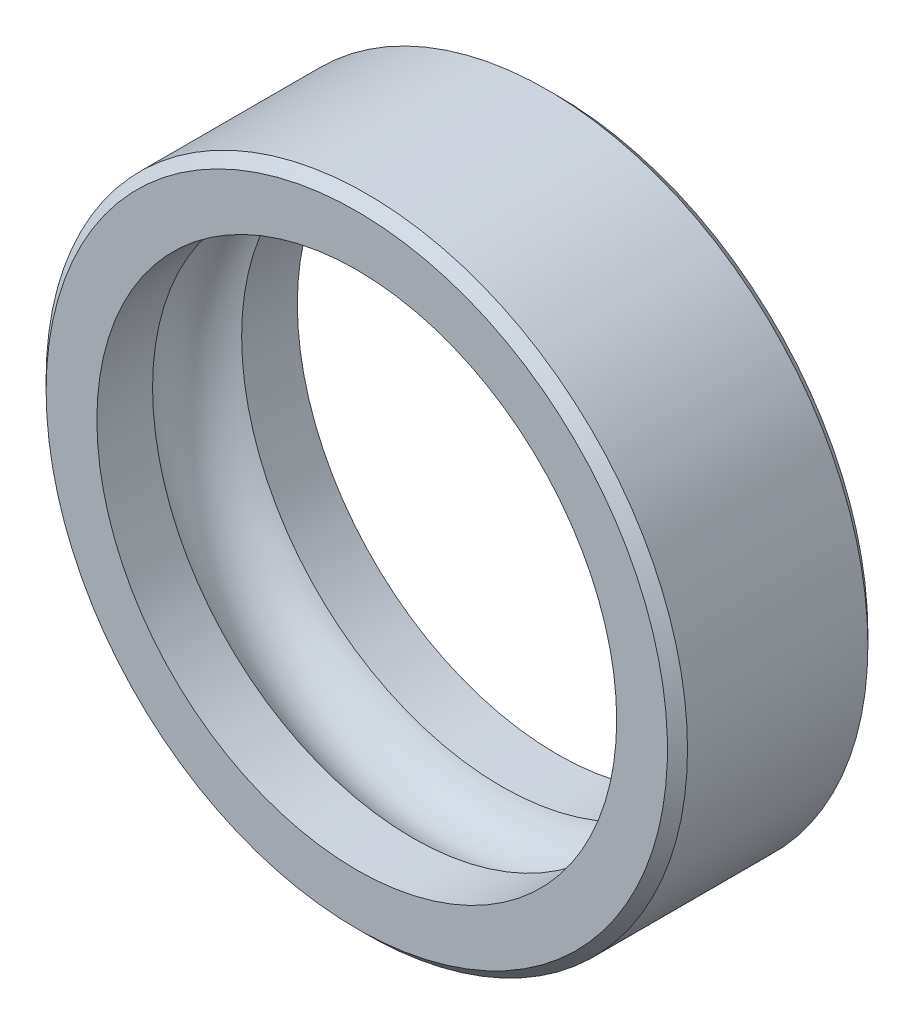
ISO-10303-21;
HEADER;
FILE_DESCRIPTION(('STEP AP214'),'2;1');
FILE_NAME('part.step','',(''),(''),'','','');
FILE_SCHEMA(('AUTOMOTIVE_DESIGN { 1 0 10303 214 1 1 1 1 }'));
ENDSEC;
DATA;
#1=APPLICATION_CONTEXT('core data for automotive mechanical design processes');
#2=APPLICATION_PROTOCOL_DEFINITION('international standard','automotive_design',2000,#1);
#3=PRODUCT_CONTEXT('',#1,'mechanical');
#4=PRODUCT('Part','Part','',(#3));
#5=PRODUCT_RELATED_PRODUCT_CATEGORY('part','',(#4));
#6=PRODUCT_DEFINITION_FORMATION('','',#4);
#7=PRODUCT_DEFINITION_CONTEXT('part definition',#1,'design');
#8=PRODUCT_DEFINITION('design','',#6,#7);
#9=PRODUCT_DEFINITION_SHAPE('','',#8);
#10=(LENGTH_UNIT() NAMED_UNIT(*) SI_UNIT(.MILLI.,.METRE.));
#11=(NAMED_UNIT(*) PLANE_ANGLE_UNIT() SI_UNIT($,.RADIAN.));
#12=(NAMED_UNIT(*) SI_UNIT($,.STERADIAN.) SOLID_ANGLE_UNIT());
#13=UNCERTAINTY_MEASURE_WITH_UNIT(LENGTH_MEASURE(1.E-05),#10,'distance_accuracy_value','');
#14=(GEOMETRIC_REPRESENTATION_CONTEXT(3) GLOBAL_UNCERTAINTY_ASSIGNED_CONTEXT((#13)) GLOBAL_UNIT_ASSIGNED_CONTEXT((#10,
#11,#12)) REPRESENTATION_CONTEXT('',''));
#15=CARTESIAN_POINT('',(0.,0.,0.));
#16=DIRECTION('',(0.,0.,1.));
#17=DIRECTION('',(1.,0.,0.));
#18=AXIS2_PLACEMENT_3D('',#15,#16,#17);
#19=CARTESIAN_POINT('',(0.,0.,0.));
#20=DIRECTION('',(0.,0.,1.));
#21=DIRECTION('',(1.,0.,0.));
#22=AXIS2_PLACEMENT_3D('',#19,#20,#21);
#23=TOROIDAL_SURFACE('',#22,6.,1.21175743903915);
#24=CARTESIAN_POINT('',(0.,0.,-1.11111111111111));
#25=DIRECTION('',(0.,0.,1.));
#26=DIRECTION('',(1.,0.,0.));
#27=AXIS2_PLACEMENT_3D('',#24,#25,#26);
#28=CIRCLE('',#27,6.48351648351648);
#29=CARTESIAN_POINT('',(6.48351648351648,0.,-1.11111111111111));
#30=VERTEX_POINT('',#29);
#31=EDGE_CURVE('E33',#30,#30,#28,.F.);
#32=ORIENTED_EDGE('',*,*,#31,.T.);
#33=EDGE_LOOP('',(#32));
#34=FACE_BOUND('',#33,.T.);
#35=CARTESIAN_POINT('',(0.,0.,1.11111111111111));
#36=DIRECTION('',(0.,0.,1.));
#37=DIRECTION('',(1.,0.,0.));
#38=AXIS2_PLACEMENT_3D('',#35,#36,#37);
#39=CIRCLE('',#38,6.48351648351648);
#40=CARTESIAN_POINT('',(6.48351648351648,0.,1.11111111111111));
#41=VERTEX_POINT('',#40);
#42=EDGE_CURVE('E30',#41,#41,#39,.T.);
#43=ORIENTED_EDGE('',*,*,#42,.T.);
#44=EDGE_LOOP('',(#43));
#45=FACE_BOUND('',#44,.T.);
#46=ADVANCED_FACE('F15',(#34,#45),#23,.F.);
#47=CARTESIAN_POINT('',(0.,0.,2.5));
#48=DIRECTION('',(0.,0.,1.));
#49=DIRECTION('',(1.,0.,0.));
#50=AXIS2_PLACEMENT_3D('',#47,#48,#49);
#51=CYLINDRICAL_SURFACE('',#50,6.48351648351648);
#52=ORIENTED_EDGE('',*,*,#31,.F.);
#53=EDGE_LOOP('',(#52));
#54=FACE_BOUND('',#53,.T.);
#55=CARTESIAN_POINT('',(0.,0.,-2.5));
#56=DIRECTION('',(0.,0.,1.));
#57=DIRECTION('',(1.,0.,0.));
#58=AXIS2_PLACEMENT_3D('',#55,#56,#57);
#59=CIRCLE('',#58,6.48351648351648);
#60=CARTESIAN_POINT('',(6.48351648351648,0.,-2.5));
#61=VERTEX_POINT('',#60);
#62=EDGE_CURVE('E18',#61,#61,#59,.F.);
#63=ORIENTED_EDGE('',*,*,#62,.T.);
#64=EDGE_LOOP('',(#63));
#65=FACE_BOUND('',#64,.T.);
#66=ADVANCED_FACE('F47',(#54,#65),#51,.F.);
#67=CARTESIAN_POINT('',(0.,0.,2.5));
#68=DIRECTION('',(0.,0.,1.));
#69=DIRECTION('',(1.,0.,0.));
#70=AXIS2_PLACEMENT_3D('',#67,#68,#69);
#71=CYLINDRICAL_SURFACE('',#70,6.48351648351648);
#72=ORIENTED_EDGE('',*,*,#42,.F.);
#73=EDGE_LOOP('',(#72));
#74=FACE_BOUND('',#73,.T.);
#75=CARTESIAN_POINT('',(0.,0.,2.5));
#76=DIRECTION('',(0.,0.,1.));
#77=DIRECTION('',(1.,0.,0.));
#78=AXIS2_PLACEMENT_3D('',#75,#76,#77);
#79=CIRCLE('',#78,6.48351648351648);
#80=CARTESIAN_POINT('',(6.48351648351648,0.,2.5));
#81=VERTEX_POINT('',#80);
#82=EDGE_CURVE('E40',#81,#81,#79,.T.);
#83=ORIENTED_EDGE('',*,*,#82,.T.);
#84=EDGE_LOOP('',(#83));
#85=FACE_BOUND('',#84,.T.);
#86=ADVANCED_FACE('F52',(#74,#85),#71,.F.);
#87=CARTESIAN_POINT('',(0.,7.75,-2.5));
#88=DIRECTION('',(0.,0.,1.));
#89=DIRECTION('',(1.,0.,0.));
#90=AXIS2_PLACEMENT_3D('',#87,#88,#89);
#91=PLANE('',#90);
#92=CARTESIAN_POINT('',(0.,0.,-2.5));
#93=DIRECTION('',(0.,0.,1.));
#94=DIRECTION('',(1.,0.,0.));
#95=AXIS2_PLACEMENT_3D('',#92,#93,#94);
#96=CIRCLE('',#95,7.75);
#97=CARTESIAN_POINT('',(7.75,0.,-2.5));
#98=VERTEX_POINT('',#97);
#99=EDGE_CURVE('E38',#98,#98,#96,.T.);
#100=ORIENTED_EDGE('',*,*,#99,.F.);
#101=EDGE_LOOP('',(#100));
#102=FACE_BOUND('',#101,.T.);
#103=ORIENTED_EDGE('',*,*,#62,.F.);
#104=EDGE_LOOP('',(#103));
#105=FACE_BOUND('',#104,.T.);
#106=ADVANCED_FACE('F49',(#102,#105),#91,.F.);
#107=CARTESIAN_POINT('',(0.,7.75,2.5));
#108=DIRECTION('',(0.,0.,-1.));
#109=DIRECTION('',(-1.,0.,0.));
#110=AXIS2_PLACEMENT_3D('',#107,#108,#109);
#111=PLANE('',#110);
#112=ORIENTED_EDGE('',*,*,#82,.F.);
#113=EDGE_LOOP('',(#112));
#114=FACE_BOUND('',#113,.T.);
#115=CARTESIAN_POINT('',(0.,0.,2.5));
#116=DIRECTION('',(0.,0.,-1.));
#117=DIRECTION('',(-1.,0.,0.));
#118=AXIS2_PLACEMENT_3D('',#115,#116,#117);
#119=CIRCLE('',#118,7.75);
#120=CARTESIAN_POINT('',(-7.75,0.,2.5));
#121=VERTEX_POINT('',#120);
#122=EDGE_CURVE('E27',#121,#121,#119,.T.);
#123=ORIENTED_EDGE('',*,*,#122,.F.);
#124=EDGE_LOOP('',(#123));
#125=FACE_BOUND('',#124,.T.);
#126=ADVANCED_FACE('F51',(#114,#125),#111,.F.);
#127=CARTESIAN_POINT('',(0.,0.,-2.25));
#128=DIRECTION('',(0.,0.,1.));
#129=DIRECTION('',(1.,0.,0.));
#130=AXIS2_PLACEMENT_3D('',#127,#128,#129);
#131=CONICAL_SURFACE('',#130,8.,0.785398163397451);
#132=CARTESIAN_POINT('',(0.,0.,-2.25));
#133=DIRECTION('',(0.,0.,1.));
#134=DIRECTION('',(1.,0.,0.));
#135=AXIS2_PLACEMENT_3D('',#132,#133,#134);
#136=CIRCLE('',#135,8.);
#137=CARTESIAN_POINT('',(8.,0.,-2.25));
#138=VERTEX_POINT('',#137);
#139=EDGE_CURVE('E22',#138,#138,#136,.T.);
#140=ORIENTED_EDGE('',*,*,#139,.F.);
#141=EDGE_LOOP('',(#140));
#142=FACE_BOUND('',#141,.T.);
#143=ORIENTED_EDGE('',*,*,#99,.T.);
#144=EDGE_LOOP('',(#143));
#145=FACE_BOUND('',#144,.T.);
#146=ADVANCED_FACE('F60',(#142,#145),#131,.T.);
#147=CARTESIAN_POINT('',(0.,0.,2.25));
#148=DIRECTION('',(0.,0.,-1.));
#149=DIRECTION('',(-1.,0.,0.));
#150=AXIS2_PLACEMENT_3D('',#147,#148,#149);
#151=CONICAL_SURFACE('',#150,8.,0.785398163397451);
#152=CARTESIAN_POINT('',(0.,0.,2.25));
#153=DIRECTION('',(0.,0.,1.));
#154=DIRECTION('',(1.,0.,0.));
#155=AXIS2_PLACEMENT_3D('',#152,#153,#154);
#156=CIRCLE('',#155,8.);
#157=CARTESIAN_POINT('',(8.,0.,2.25));
#158=VERTEX_POINT('',#157);
#159=EDGE_CURVE('E10',#158,#158,#156,.F.);
#160=ORIENTED_EDGE('',*,*,#159,.F.);
#161=EDGE_LOOP('',(#160));
#162=FACE_BOUND('',#161,.T.);
#163=ORIENTED_EDGE('',*,*,#122,.T.);
#164=EDGE_LOOP('',(#163));
#165=FACE_BOUND('',#164,.T.);
#166=ADVANCED_FACE('F68',(#162,#165),#151,.T.);
#167=CARTESIAN_POINT('',(0.,0.,2.5));
#168=DIRECTION('',(0.,0.,1.));
#169=DIRECTION('',(1.,0.,0.));
#170=AXIS2_PLACEMENT_3D('',#167,#168,#169);
#171=CYLINDRICAL_SURFACE('',#170,8.);
#172=ORIENTED_EDGE('',*,*,#159,.T.);
#173=EDGE_LOOP('',(#172));
#174=FACE_BOUND('',#173,.T.);
#175=ORIENTED_EDGE('',*,*,#139,.T.);
#176=EDGE_LOOP('',(#175));
#177=FACE_BOUND('',#176,.T.);
#178=ADVANCED_FACE('F66',(#174,#177),#171,.T.);
#179=CLOSED_SHELL('',(#46,#66,#86,#106,#126,#146,#166,#178));
#180=MANIFOLD_SOLID_BREP('B1',#179);
#181=ADVANCED_BREP_SHAPE_REPRESENTATION('',(#18,#180),#14);
#182=SHAPE_DEFINITION_REPRESENTATION(#9,#181);
ENDSEC;
END-ISO-10303-21;
